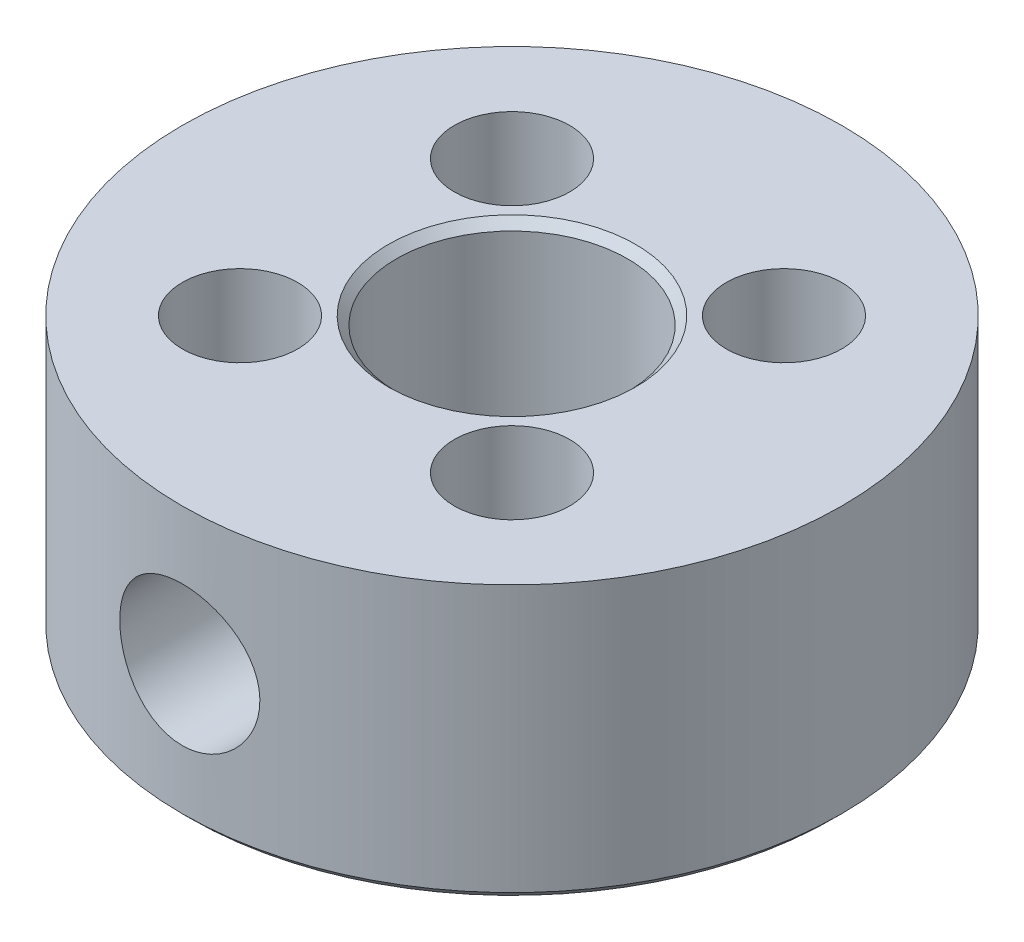
ISO-10303-21;
HEADER;
FILE_DESCRIPTION(('STEP AP214'),'2;1');
FILE_NAME('part.step','',(''),(''),'','','');
FILE_SCHEMA(('AUTOMOTIVE_DESIGN { 1 0 10303 214 1 1 1 1 }'));
ENDSEC;
DATA;
#1=APPLICATION_CONTEXT('core data for automotive mechanical design processes');
#2=APPLICATION_PROTOCOL_DEFINITION('international standard','automotive_design',2000,#1);
#3=PRODUCT_CONTEXT('',#1,'mechanical');
#4=PRODUCT('Part','Part','',(#3));
#5=PRODUCT_RELATED_PRODUCT_CATEGORY('part','',(#4));
#6=PRODUCT_DEFINITION_FORMATION('','',#4);
#7=PRODUCT_DEFINITION_CONTEXT('part definition',#1,'design');
#8=PRODUCT_DEFINITION('design','',#6,#7);
#9=PRODUCT_DEFINITION_SHAPE('','',#8);
#10=(LENGTH_UNIT() NAMED_UNIT(*) SI_UNIT(.MILLI.,.METRE.));
#11=(NAMED_UNIT(*) PLANE_ANGLE_UNIT() SI_UNIT($,.RADIAN.));
#12=(NAMED_UNIT(*) SI_UNIT($,.STERADIAN.) SOLID_ANGLE_UNIT());
#13=UNCERTAINTY_MEASURE_WITH_UNIT(LENGTH_MEASURE(1.E-05),#10,'distance_accuracy_value','');
#14=(GEOMETRIC_REPRESENTATION_CONTEXT(3) GLOBAL_UNCERTAINTY_ASSIGNED_CONTEXT((#13)) GLOBAL_UNIT_ASSIGNED_CONTEXT((#10,
#11,#12)) REPRESENTATION_CONTEXT('',''));
#15=CARTESIAN_POINT('',(0.,0.,0.));
#16=DIRECTION('',(0.,0.,1.));
#17=DIRECTION('',(1.,0.,0.));
#18=AXIS2_PLACEMENT_3D('',#15,#16,#17);
#19=CARTESIAN_POINT('',(-30.4497461438242,18.50200000001,-4.94974614382413));
#20=DIRECTION('',(0.,1.,0.));
#21=DIRECTION('',(0.,0.,1.));
#22=AXIS2_PLACEMENT_3D('',#19,#20,#21);
#23=CYLINDRICAL_SURFACE('',#22,1.25);
#24=CARTESIAN_POINT('',(-30.4497461438242,10.50000000001,-4.94974614382413));
#25=DIRECTION('',(0.,1.,0.));
#26=DIRECTION('',(0.,0.,1.));
#27=AXIS2_PLACEMENT_3D('',#24,#25,#26);
#28=CIRCLE('',#27,1.25);
#29=CARTESIAN_POINT('',(-30.4497461438242,10.50000000001,-3.69974614382413));
#30=VERTEX_POINT('',#29);
#31=EDGE_CURVE('E20',#30,#30,#28,.F.);
#32=ORIENTED_EDGE('',*,*,#31,.F.);
#33=EDGE_LOOP('',(#32));
#34=FACE_BOUND('',#33,.T.);
#35=CARTESIAN_POINT('',(-30.4497461438242,8.80000000000791,-4.94974614382413));
#36=DIRECTION('',(0.,-1.,0.));
#37=DIRECTION('',(0.,0.,-1.));
#38=AXIS2_PLACEMENT_3D('',#35,#36,#37);
#39=CIRCLE('',#38,1.24999999998268);
#40=CARTESIAN_POINT('',(-30.4497461438242,8.80000000000896,-3.69974614383279));
#41=VERTEX_POINT('',#40);
#42=EDGE_CURVE('E148',#41,#41,#39,.T.);
#43=ORIENTED_EDGE('',*,*,#42,.T.);
#44=EDGE_LOOP('',(#43));
#45=FACE_BOUND('',#44,.T.);
#46=ADVANCED_FACE('F17',(#34,#45),#23,.F.);
#47=CARTESIAN_POINT('',(-20.5502538561759,18.50200000001,-4.94974614382412));
#48=DIRECTION('',(0.,1.,0.));
#49=DIRECTION('',(0.,0.,1.));
#50=AXIS2_PLACEMENT_3D('',#47,#48,#49);
#51=CYLINDRICAL_SURFACE('',#50,1.25);
#52=CARTESIAN_POINT('',(-20.5502538561759,10.50000000001,-4.94974614382412));
#53=DIRECTION('',(0.,1.,0.));
#54=DIRECTION('',(0.,0.,1.));
#55=AXIS2_PLACEMENT_3D('',#52,#53,#54);
#56=CIRCLE('',#55,1.25);
#57=CARTESIAN_POINT('',(-20.5502538561759,10.50000000001,-3.69974614382412));
#58=VERTEX_POINT('',#57);
#59=EDGE_CURVE('E105',#58,#58,#56,.F.);
#60=ORIENTED_EDGE('',*,*,#59,.F.);
#61=EDGE_LOOP('',(#60));
#62=FACE_BOUND('',#61,.T.);
#63=CARTESIAN_POINT('',(-20.5502538561759,8.80000000000791,-4.94974614382412));
#64=DIRECTION('',(0.,-1.,0.));
#65=DIRECTION('',(0.,0.,-1.));
#66=AXIS2_PLACEMENT_3D('',#63,#64,#65);
#67=CIRCLE('',#66,1.24999999998269);
#68=CARTESIAN_POINT('',(-20.5502538561759,8.80000000000896,-3.69974614383278));
#69=VERTEX_POINT('',#68);
#70=EDGE_CURVE('E114',#69,#69,#67,.T.);
#71=ORIENTED_EDGE('',*,*,#70,.T.);
#72=EDGE_LOOP('',(#71));
#73=FACE_BOUND('',#72,.T.);
#74=ADVANCED_FACE('F289',(#62,#73),#51,.F.);
#75=CARTESIAN_POINT('',(-20.5502538561759,18.50200000001,4.94974614382412));
#76=DIRECTION('',(0.,1.,0.));
#77=DIRECTION('',(0.,0.,1.));
#78=AXIS2_PLACEMENT_3D('',#75,#76,#77);
#79=CYLINDRICAL_SURFACE('',#78,1.25);
#80=CARTESIAN_POINT('',(-20.5502538561759,10.50000000001,4.94974614382412));
#81=DIRECTION('',(0.,1.,0.));
#82=DIRECTION('',(0.,0.,1.));
#83=AXIS2_PLACEMENT_3D('',#80,#81,#82);
#84=CIRCLE('',#83,1.25);
#85=CARTESIAN_POINT('',(-20.5502538561759,10.50000000001,6.19974614382412));
#86=VERTEX_POINT('',#85);
#87=EDGE_CURVE('E222',#86,#86,#84,.F.);
#88=ORIENTED_EDGE('',*,*,#87,.F.);
#89=EDGE_LOOP('',(#88));
#90=FACE_BOUND('',#89,.T.);
#91=CARTESIAN_POINT('',(-20.5502538561759,8.80000000006476,4.94974614382412));
#92=DIRECTION('',(0.,-1.,0.));
#93=DIRECTION('',(0.,0.,-1.));
#94=AXIS2_PLACEMENT_3D('',#91,#92,#93);
#95=CIRCLE('',#94,1.2499999999582);
#96=CARTESIAN_POINT('',(-20.5502538561759,8.80000000003738,6.19974614380322));
#97=VERTEX_POINT('',#96);
#98=EDGE_CURVE('E33',#97,#97,#95,.T.);
#99=ORIENTED_EDGE('',*,*,#98,.T.);
#100=EDGE_LOOP('',(#99));
#101=FACE_BOUND('',#100,.T.);
#102=ADVANCED_FACE('F286',(#90,#101),#79,.F.);
#103=CARTESIAN_POINT('',(-30.4497461438242,18.50200000001,4.94974614382412));
#104=DIRECTION('',(0.,1.,0.));
#105=DIRECTION('',(0.,0.,1.));
#106=AXIS2_PLACEMENT_3D('',#103,#104,#105);
#107=CYLINDRICAL_SURFACE('',#106,1.25);
#108=CARTESIAN_POINT('',(-30.4497461438242,10.50000000001,4.94974614382412));
#109=DIRECTION('',(0.,1.,0.));
#110=DIRECTION('',(0.,0.,1.));
#111=AXIS2_PLACEMENT_3D('',#108,#109,#110);
#112=CIRCLE('',#111,1.25);
#113=CARTESIAN_POINT('',(-30.4497461438242,10.50000000001,6.19974614382412));
#114=VERTEX_POINT('',#113);
#115=EDGE_CURVE('E219',#114,#114,#112,.F.);
#116=ORIENTED_EDGE('',*,*,#115,.F.);
#117=EDGE_LOOP('',(#116));
#118=FACE_BOUND('',#117,.T.);
#119=CARTESIAN_POINT('',(-30.4497461438242,8.80000000006476,4.94974614382412));
#120=DIRECTION('',(0.,-1.,0.));
#121=DIRECTION('',(0.,0.,-1.));
#122=AXIS2_PLACEMENT_3D('',#119,#120,#121);
#123=CIRCLE('',#122,1.2499999999582);
#124=CARTESIAN_POINT('',(-30.4497461438242,8.80000000003738,6.19974614380322));
#125=VERTEX_POINT('',#124);
#126=EDGE_CURVE('E152',#125,#125,#123,.T.);
#127=ORIENTED_EDGE('',*,*,#126,.T.);
#128=EDGE_LOOP('',(#127));
#129=FACE_BOUND('',#128,.T.);
#130=ADVANCED_FACE('F282',(#118,#129),#107,.F.);
#131=CARTESIAN_POINT('',(-20.5502538561759,8.49999999996953,4.94974614382412));
#132=DIRECTION('',(0.,-1.,0.));
#133=DIRECTION('',(0.,0.,-1.));
#134=AXIS2_PLACEMENT_3D('',#131,#132,#133);
#135=CONICAL_SURFACE('',#134,1.54999999999658,0.785398163302709);
#136=ORIENTED_EDGE('',*,*,#98,.F.);
#137=EDGE_LOOP('',(#136));
#138=FACE_BOUND('',#137,.T.);
#139=CARTESIAN_POINT('',(-20.5502538561759,8.49999999996953,4.94974614382412));
#140=DIRECTION('',(0.,-1.,0.));
#141=DIRECTION('',(0.,0.,-1.));
#142=AXIS2_PLACEMENT_3D('',#139,#140,#141);
#143=CIRCLE('',#142,1.54999999999658);
#144=CARTESIAN_POINT('',(-20.5502538561759,8.49999999996953,6.4997461438207));
#145=VERTEX_POINT('',#144);
#146=EDGE_CURVE('E217',#145,#145,#143,.T.);
#147=ORIENTED_EDGE('',*,*,#146,.T.);
#148=EDGE_LOOP('',(#147));
#149=FACE_BOUND('',#148,.T.);
#150=ADVANCED_FACE('F278',(#138,#149),#135,.F.);
#151=CARTESIAN_POINT('',(-30.4497461438242,8.49999999996953,4.94974614382412));
#152=DIRECTION('',(0.,-1.,0.));
#153=DIRECTION('',(0.,0.,-1.));
#154=AXIS2_PLACEMENT_3D('',#151,#152,#153);
#155=CONICAL_SURFACE('',#154,1.54999999999658,0.785398163302709);
#156=ORIENTED_EDGE('',*,*,#126,.F.);
#157=EDGE_LOOP('',(#156));
#158=FACE_BOUND('',#157,.T.);
#159=CARTESIAN_POINT('',(-30.4497461438242,8.49999999996953,4.94974614382412));
#160=DIRECTION('',(0.,-1.,0.));
#161=DIRECTION('',(0.,0.,-1.));
#162=AXIS2_PLACEMENT_3D('',#159,#160,#161);
#163=CIRCLE('',#162,1.54999999999658);
#164=CARTESIAN_POINT('',(-30.4497461438242,8.49999999996953,6.4997461438207));
#165=VERTEX_POINT('',#164);
#166=EDGE_CURVE('E215',#165,#165,#163,.T.);
#167=ORIENTED_EDGE('',*,*,#166,.T.);
#168=EDGE_LOOP('',(#167));
#169=FACE_BOUND('',#168,.T.);
#170=ADVANCED_FACE('F274',(#158,#169),#155,.F.);
#171=CARTESIAN_POINT('',(-30.4497461438242,8.50000000002638,-4.94974614382413));
#172=DIRECTION('',(0.,-1.,0.));
#173=DIRECTION('',(0.,0.,-1.));
#174=AXIS2_PLACEMENT_3D('',#171,#172,#173);
#175=CONICAL_SURFACE('',#174,1.54999999996421,0.785398163397448);
#176=ORIENTED_EDGE('',*,*,#42,.F.);
#177=EDGE_LOOP('',(#176));
#178=FACE_BOUND('',#177,.T.);
#179=CARTESIAN_POINT('',(-30.4497461438242,8.50000000002638,-4.94974614382413));
#180=DIRECTION('',(0.,-1.,0.));
#181=DIRECTION('',(0.,0.,-1.));
#182=AXIS2_PLACEMENT_3D('',#179,#180,#181);
#183=CIRCLE('',#182,1.54999999996421);
#184=CARTESIAN_POINT('',(-30.4497461438242,8.50000000002638,-3.39974614385992));
#185=VERTEX_POINT('',#184);
#186=EDGE_CURVE('E213',#185,#185,#183,.T.);
#187=ORIENTED_EDGE('',*,*,#186,.T.);
#188=EDGE_LOOP('',(#187));
#189=FACE_BOUND('',#188,.T.);
#190=ADVANCED_FACE('F270',(#178,#189),#175,.F.);
#191=CARTESIAN_POINT('',(-20.5502538561759,8.50000000002638,-4.94974614382412));
#192=DIRECTION('',(0.,-1.,0.));
#193=DIRECTION('',(0.,0.,-1.));
#194=AXIS2_PLACEMENT_3D('',#191,#192,#193);
#195=CONICAL_SURFACE('',#194,1.54999999996422,0.785398163397448);
#196=ORIENTED_EDGE('',*,*,#70,.F.);
#197=EDGE_LOOP('',(#196));
#198=FACE_BOUND('',#197,.T.);
#199=CARTESIAN_POINT('',(-20.5502538561759,8.50000000002638,-4.94974614382412));
#200=DIRECTION('',(0.,-1.,0.));
#201=DIRECTION('',(0.,0.,-1.));
#202=AXIS2_PLACEMENT_3D('',#199,#200,#201);
#203=CIRCLE('',#202,1.54999999996422);
#204=CARTESIAN_POINT('',(-20.5502538561759,8.50000000002638,-3.3997461438599));
#205=VERTEX_POINT('',#204);
#206=EDGE_CURVE('E211',#205,#205,#203,.T.);
#207=ORIENTED_EDGE('',*,*,#206,.T.);
#208=EDGE_LOOP('',(#207));
#209=FACE_BOUND('',#208,.T.);
#210=ADVANCED_FACE('F230',(#198,#209),#195,.F.);
#211=CARTESIAN_POINT('',(-35.50000000002,10.50000000001,0.));
#212=DIRECTION('',(0.,1.,0.));
#213=DIRECTION('',(0.,0.,1.));
#214=AXIS2_PLACEMENT_3D('',#211,#212,#213);
#215=PLANE('',#214);
#216=ORIENTED_EDGE('',*,*,#31,.T.);
#217=EDGE_LOOP('',(#216));
#218=FACE_BOUND('',#217,.T.);
#219=CARTESIAN_POINT('',(-30.4497461438242,10.50000000001,-4.94974614382413));
#220=DIRECTION('',(0.,1.,0.));
#221=DIRECTION('',(0.,0.,1.));
#222=AXIS2_PLACEMENT_3D('',#219,#220,#221);
#223=CIRCLE('',#222,2.1);
#224=CARTESIAN_POINT('',(-30.4497461438242,10.50000000001,-2.84974614382413));
#225=VERTEX_POINT('',#224);
#226=EDGE_CURVE('E207',#225,#225,#223,.T.);
#227=ORIENTED_EDGE('',*,*,#226,.T.);
#228=EDGE_LOOP('',(#227));
#229=FACE_BOUND('',#228,.T.);
#230=ADVANCED_FACE('F226',(#218,#229),#215,.T.);
#231=CARTESIAN_POINT('',(-35.50000000002,10.50000000001,0.));
#232=DIRECTION('',(0.,1.,0.));
#233=DIRECTION('',(0.,0.,1.));
#234=AXIS2_PLACEMENT_3D('',#231,#232,#233);
#235=PLANE('',#234);
#236=ORIENTED_EDGE('',*,*,#59,.T.);
#237=EDGE_LOOP('',(#236));
#238=FACE_BOUND('',#237,.T.);
#239=CARTESIAN_POINT('',(-20.5502538561759,10.50000000001,-4.94974614382412));
#240=DIRECTION('',(0.,1.,0.));
#241=DIRECTION('',(0.,0.,1.));
#242=AXIS2_PLACEMENT_3D('',#239,#240,#241);
#243=CIRCLE('',#242,2.1);
#244=CARTESIAN_POINT('',(-20.5502538561759,10.50000000001,-2.84974614382412));
#245=VERTEX_POINT('',#244);
#246=EDGE_CURVE('E205',#245,#245,#243,.T.);
#247=ORIENTED_EDGE('',*,*,#246,.T.);
#248=EDGE_LOOP('',(#247));
#249=FACE_BOUND('',#248,.T.);
#250=ADVANCED_FACE('F229',(#238,#249),#235,.T.);
#251=CARTESIAN_POINT('',(-35.50000000002,10.50000000001,0.));
#252=DIRECTION('',(0.,1.,0.));
#253=DIRECTION('',(0.,0.,1.));
#254=AXIS2_PLACEMENT_3D('',#251,#252,#253);
#255=PLANE('',#254);
#256=ORIENTED_EDGE('',*,*,#87,.T.);
#257=EDGE_LOOP('',(#256));
#258=FACE_BOUND('',#257,.T.);
#259=CARTESIAN_POINT('',(-20.5502538561759,10.50000000001,4.94974614382412));
#260=DIRECTION('',(0.,1.,0.));
#261=DIRECTION('',(0.,0.,1.));
#262=AXIS2_PLACEMENT_3D('',#259,#260,#261);
#263=CIRCLE('',#262,2.1);
#264=CARTESIAN_POINT('',(-20.5502538561759,10.50000000001,7.04974614382412));
#265=VERTEX_POINT('',#264);
#266=EDGE_CURVE('E203',#265,#265,#263,.T.);
#267=ORIENTED_EDGE('',*,*,#266,.T.);
#268=EDGE_LOOP('',(#267));
#269=FACE_BOUND('',#268,.T.);
#270=ADVANCED_FACE('F261',(#258,#269),#255,.T.);
#271=CARTESIAN_POINT('',(-35.50000000002,10.50000000001,0.));
#272=DIRECTION('',(0.,1.,0.));
#273=DIRECTION('',(0.,0.,1.));
#274=AXIS2_PLACEMENT_3D('',#271,#272,#273);
#275=PLANE('',#274);
#276=ORIENTED_EDGE('',*,*,#115,.T.);
#277=EDGE_LOOP('',(#276));
#278=FACE_BOUND('',#277,.T.);
#279=CARTESIAN_POINT('',(-30.4497461438242,10.50000000001,4.94974614382412));
#280=DIRECTION('',(0.,1.,0.));
#281=DIRECTION('',(0.,0.,1.));
#282=AXIS2_PLACEMENT_3D('',#279,#280,#281);
#283=CIRCLE('',#282,2.1);
#284=CARTESIAN_POINT('',(-30.4497461438242,10.50000000001,7.04974614382412));
#285=VERTEX_POINT('',#284);
#286=EDGE_CURVE('E144',#285,#285,#283,.T.);
#287=ORIENTED_EDGE('',*,*,#286,.T.);
#288=EDGE_LOOP('',(#287));
#289=FACE_BOUND('',#288,.T.);
#290=ADVANCED_FACE('F257',(#278,#289),#275,.T.);
#291=CARTESIAN_POINT('',(-25.5,8.50000000002638,0.));
#292=DIRECTION('',(0.,-1.,0.));
#293=DIRECTION('',(0.,0.,-1.));
#294=AXIS2_PLACEMENT_3D('',#291,#292,#293);
#295=CONICAL_SURFACE('',#294,4.49999999995043,0.785398163302709);
#296=CARTESIAN_POINT('',(-25.5,8.80000000001,0.));
#297=DIRECTION('',(0.,1.,0.));
#298=DIRECTION('',(0.,0.,1.));
#299=AXIS2_PLACEMENT_3D('',#296,#297,#298);
#300=CIRCLE('',#299,4.2);
#301=CARTESIAN_POINT('',(-25.5,8.80000000000896,4.20000000001287));
#302=VERTEX_POINT('',#301);
#303=EDGE_CURVE('E137',#302,#302,#300,.T.);
#304=ORIENTED_EDGE('',*,*,#303,.T.);
#305=EDGE_LOOP('',(#304));
#306=FACE_BOUND('',#305,.T.);
#307=CARTESIAN_POINT('',(-25.5,8.50000000002638,0.));
#308=DIRECTION('',(0.,-1.,0.));
#309=DIRECTION('',(0.,0.,-1.));
#310=AXIS2_PLACEMENT_3D('',#307,#308,#309);
#311=CIRCLE('',#310,4.49999999995043);
#312=CARTESIAN_POINT('',(-25.5,8.50000000002638,4.49999999995043));
#313=VERTEX_POINT('',#312);
#314=EDGE_CURVE('E209',#313,#313,#311,.T.);
#315=ORIENTED_EDGE('',*,*,#314,.T.);
#316=EDGE_LOOP('',(#315));
#317=FACE_BOUND('',#316,.T.);
#318=ADVANCED_FACE('F253',(#306,#317),#295,.F.);
#319=CARTESIAN_POINT('',(-35.50000000002,8.50000000001,0.));
#320=DIRECTION('',(0.,1.,0.));
#321=DIRECTION('',(0.,0.,1.));
#322=AXIS2_PLACEMENT_3D('',#319,#320,#321);
#323=PLANE('',#322);
#324=CARTESIAN_POINT('',(-25.5,8.50000000001077,0.));
#325=DIRECTION('',(0.,1.,0.));
#326=DIRECTION('',(0.,0.,1.));
#327=AXIS2_PLACEMENT_3D('',#324,#325,#326);
#328=CIRCLE('',#327,11.6999999999992);
#329=CARTESIAN_POINT('',(-25.5,8.50000000001077,11.6999999999992));
#330=VERTEX_POINT('',#329);
#331=EDGE_CURVE('E139',#330,#330,#328,.T.);
#332=ORIENTED_EDGE('',*,*,#331,.F.);
#333=EDGE_LOOP('',(#332));
#334=FACE_BOUND('',#333,.T.);
#335=ORIENTED_EDGE('',*,*,#314,.F.);
#336=EDGE_LOOP('',(#335));
#337=FACE_BOUND('',#336,.T.);
#338=ORIENTED_EDGE('',*,*,#206,.F.);
#339=EDGE_LOOP('',(#338));
#340=FACE_BOUND('',#339,.T.);
#341=ORIENTED_EDGE('',*,*,#186,.F.);
#342=EDGE_LOOP('',(#341));
#343=FACE_BOUND('',#342,.T.);
#344=ORIENTED_EDGE('',*,*,#166,.F.);
#345=EDGE_LOOP('',(#344));
#346=FACE_BOUND('',#345,.T.);
#347=ORIENTED_EDGE('',*,*,#146,.F.);
#348=EDGE_LOOP('',(#347));
#349=FACE_BOUND('',#348,.T.);
#350=ADVANCED_FACE('F247',(#334,#337,#340,#343,#346,#349),#323,.F.);
#351=CARTESIAN_POINT('',(-25.5,18.4999999999036,0.));
#352=DIRECTION('',(0.,1.,0.));
#353=DIRECTION('',(0.,0.,1.));
#354=AXIS2_PLACEMENT_3D('',#351,#352,#353);
#355=CONICAL_SURFACE('',#354,4.49999999989359,0.785398163397448);
#356=CARTESIAN_POINT('',(-25.5,18.4999999999604,0.));
#357=DIRECTION('',(0.,1.,0.));
#358=DIRECTION('',(0.,0.,1.));
#359=AXIS2_PLACEMENT_3D('',#356,#357,#358);
#360=CIRCLE('',#359,4.49999999995043);
#361=CARTESIAN_POINT('',(-25.5,18.4999999999604,4.49999999995043));
#362=VERTEX_POINT('',#361);
#363=EDGE_CURVE('E194',#362,#362,#360,.F.);
#364=ORIENTED_EDGE('',*,*,#363,.F.);
#365=EDGE_LOOP('',(#364));
#366=FACE_BOUND('',#365,.T.);
#367=CARTESIAN_POINT('',(-25.5,18.20000000001,0.));
#368=DIRECTION('',(0.,1.,0.));
#369=DIRECTION('',(0.,0.,1.));
#370=AXIS2_PLACEMENT_3D('',#367,#368,#369);
#371=CIRCLE('',#370,4.2);
#372=CARTESIAN_POINT('',(-25.5,18.2000000000229,4.19999999998445));
#373=VERTEX_POINT('',#372);
#374=EDGE_CURVE('E140',#373,#373,#371,.F.);
#375=ORIENTED_EDGE('',*,*,#374,.T.);
#376=EDGE_LOOP('',(#375));
#377=FACE_BOUND('',#376,.T.);
#378=ADVANCED_FACE('F237',(#366,#377),#355,.F.);
#379=CARTESIAN_POINT('',(-30.4497461438242,18.50200000001,-4.94974614382413));
#380=DIRECTION('',(0.,1.,0.));
#381=DIRECTION('',(0.,0.,1.));
#382=AXIS2_PLACEMENT_3D('',#379,#380,#381);
#383=CYLINDRICAL_SURFACE('',#382,2.1);
#384=CARTESIAN_POINT('',(-30.4497461438242,18.50000000001,-4.94974614382413));
#385=DIRECTION('',(0.,1.,0.));
#386=DIRECTION('',(0.,0.,1.));
#387=AXIS2_PLACEMENT_3D('',#384,#385,#386);
#388=CIRCLE('',#387,2.1);
#389=CARTESIAN_POINT('',(-30.4497461438242,18.50000000001,-2.84974614382413));
#390=VERTEX_POINT('',#389);
#391=EDGE_CURVE('E192',#390,#390,#388,.F.);
#392=ORIENTED_EDGE('',*,*,#391,.F.);
#393=EDGE_LOOP('',(#392));
#394=FACE_BOUND('',#393,.T.);
#395=ORIENTED_EDGE('',*,*,#226,.F.);
#396=EDGE_LOOP('',(#395));
#397=FACE_BOUND('',#396,.T.);
#398=ADVANCED_FACE('F234',(#394,#397),#383,.F.);
#399=CARTESIAN_POINT('',(-20.5502538561759,18.50200000001,-4.94974614382412));
#400=DIRECTION('',(0.,1.,0.));
#401=DIRECTION('',(0.,0.,1.));
#402=AXIS2_PLACEMENT_3D('',#399,#400,#401);
#403=CYLINDRICAL_SURFACE('',#402,2.1);
#404=CARTESIAN_POINT('',(-20.5502538561759,18.50000000001,-4.94974614382412));
#405=DIRECTION('',(0.,1.,0.));
#406=DIRECTION('',(0.,0.,1.));
#407=AXIS2_PLACEMENT_3D('',#404,#405,#406);
#408=CIRCLE('',#407,2.1);
#409=CARTESIAN_POINT('',(-20.5502538561759,18.50000000001,-2.84974614382412));
#410=VERTEX_POINT('',#409);
#411=EDGE_CURVE('E189',#410,#410,#408,.F.);
#412=ORIENTED_EDGE('',*,*,#411,.F.);
#413=EDGE_LOOP('',(#412));
#414=FACE_BOUND('',#413,.T.);
#415=ORIENTED_EDGE('',*,*,#246,.F.);
#416=EDGE_LOOP('',(#415));
#417=FACE_BOUND('',#416,.T.);
#418=ADVANCED_FACE('F236',(#414,#417),#403,.F.);
#419=CARTESIAN_POINT('',(-20.5502538561759,18.50200000001,4.94974614382412));
#420=DIRECTION('',(0.,1.,0.));
#421=DIRECTION('',(0.,0.,1.));
#422=AXIS2_PLACEMENT_3D('',#419,#420,#421);
#423=CYLINDRICAL_SURFACE('',#422,2.1);
#424=CARTESIAN_POINT('',(-20.5502538561759,18.50000000001,4.94974614382412));
#425=DIRECTION('',(0.,1.,0.));
#426=DIRECTION('',(0.,0.,1.));
#427=AXIS2_PLACEMENT_3D('',#424,#425,#426);
#428=CIRCLE('',#427,2.1);
#429=CARTESIAN_POINT('',(-20.5502538561759,18.50000000001,7.04974614382412));
#430=VERTEX_POINT('',#429);
#431=EDGE_CURVE('E186',#430,#430,#428,.F.);
#432=ORIENTED_EDGE('',*,*,#431,.F.);
#433=EDGE_LOOP('',(#432));
#434=FACE_BOUND('',#433,.T.);
#435=ORIENTED_EDGE('',*,*,#266,.F.);
#436=EDGE_LOOP('',(#435));
#437=FACE_BOUND('',#436,.T.);
#438=ADVANCED_FACE('F244',(#434,#437),#423,.F.);
#439=CARTESIAN_POINT('',(-30.4497461438242,18.50200000001,4.94974614382412));
#440=DIRECTION('',(0.,1.,0.));
#441=DIRECTION('',(0.,0.,1.));
#442=AXIS2_PLACEMENT_3D('',#439,#440,#441);
#443=CYLINDRICAL_SURFACE('',#442,2.1);
#444=CARTESIAN_POINT('',(-30.4497461438242,18.50000000001,4.94974614382412));
#445=DIRECTION('',(0.,1.,0.));
#446=DIRECTION('',(0.,0.,1.));
#447=AXIS2_PLACEMENT_3D('',#444,#445,#446);
#448=CIRCLE('',#447,2.1);
#449=CARTESIAN_POINT('',(-30.4497461438242,18.50000000001,7.04974614382412));
#450=VERTEX_POINT('',#449);
#451=EDGE_CURVE('E132',#450,#450,#448,.F.);
#452=ORIENTED_EDGE('',*,*,#451,.F.);
#453=EDGE_LOOP('',(#452));
#454=FACE_BOUND('',#453,.T.);
#455=ORIENTED_EDGE('',*,*,#286,.F.);
#456=EDGE_LOOP('',(#455));
#457=FACE_BOUND('',#456,.T.);
#458=ADVANCED_FACE('F414',(#454,#457),#443,.F.);
#459=CARTESIAN_POINT('',(-25.5,18.50200000001,0.));
#460=DIRECTION('',(0.,1.,0.));
#461=DIRECTION('',(0.,0.,1.));
#462=AXIS2_PLACEMENT_3D('',#459,#460,#461);
#463=CYLINDRICAL_SURFACE('',#462,4.2);
#464=CARTESIAN_POINT('',(-28.0466918310846,13.3701511743004,3.33981447351304));
#465=CARTESIAN_POINT('',(-28.0399996927325,13.2388615684585,3.34491603063782));
#466=CARTESIAN_POINT('',(-28.023102492779,13.1084142548455,3.35783801589314));
#467=CARTESIAN_POINT('',(-27.9701303416004,12.8534980770102,3.39698439092769));
#468=CARTESIAN_POINT('',(-27.9340270450937,12.7290383463658,3.42322843942132));
#469=CARTESIAN_POINT('',(-27.8449347452476,12.4900840818974,3.48484833870774));
#470=CARTESIAN_POINT('',(-27.7920841493058,12.3755173307071,3.52014890239554));
#471=CARTESIAN_POINT('',(-27.6711214840442,12.1567315719691,3.59601547695757));
#472=CARTESIAN_POINT('',(-27.6030070928127,12.0525141422333,3.63658228853226));
#473=CARTESIAN_POINT('',(-27.4425014345844,11.8419831940034,3.72507480071735));
#474=CARTESIAN_POINT('',(-27.3480649178397,11.7373280620777,3.77324875811566));
#475=CARTESIAN_POINT('',(-27.1425461857975,11.5443881769187,3.86714613784206));
#476=CARTESIAN_POINT('',(-27.031453306492,11.456113992977,3.91286796457863));
#477=CARTESIAN_POINT('',(-26.786672101706,11.2932096934457,4.00030022973895));
#478=CARTESIAN_POINT('',(-26.6519938706441,11.2198109033266,4.04156803311493));
#479=CARTESIAN_POINT('',(-26.3689270226317,11.0976813339225,4.11170609338944));
#480=CARTESIAN_POINT('',(-26.2205565186165,11.0489185026417,4.14059245139574));
#481=CARTESIAN_POINT('',(-25.934072656692,10.9834663732055,4.17969510752418));
#482=CARTESIAN_POINT('',(-25.7969484958791,10.9635650830715,4.19177349690257));
#483=CARTESIAN_POINT('',(-25.5207983243213,10.9463428741486,4.20221465044528));
#484=CARTESIAN_POINT('',(-25.3817735878406,10.9490075021478,4.20058619369144));
#485=CARTESIAN_POINT('',(-25.1214938622602,10.9752203028051,4.18472587081963));
#486=CARTESIAN_POINT('',(-24.9999183155986,10.9965231338,4.17184931761434));
#487=CARTESIAN_POINT('',(-24.7624332205967,11.055929364554,4.13647339406768));
#488=CARTESIAN_POINT('',(-24.646524431958,11.0940350101223,4.11397273741222));
#489=CARTESIAN_POINT('',(-24.4187618021801,11.1871830505372,4.06018784499785));
#490=CARTESIAN_POINT('',(-24.3072116148504,11.2427942584789,4.02861228490887));
#491=CARTESIAN_POINT('',(-24.0947152493664,11.3685822676862,3.95950488985953));
#492=CARTESIAN_POINT('',(-23.9937728852432,11.4387642810644,3.92197092465622));
#493=CARTESIAN_POINT('',(-23.7910623118112,11.602324408979,3.83837056587799));
#494=CARTESIAN_POINT('',(-23.6909737377163,11.6975468324155,3.79183351606557));
#495=CARTESIAN_POINT('',(-23.5073047618537,11.902907053756,3.69862132286565));
#496=CARTESIAN_POINT('',(-23.4237493027998,12.0130669715259,3.65194607704245));
#497=CARTESIAN_POINT('',(-23.2676810987158,12.2581253760449,3.55889957098511));
#498=CARTESIAN_POINT('',(-23.1969770094894,12.3943806079902,3.51298031173102));
#499=CARTESIAN_POINT('',(-23.1095990181085,12.608690241505,3.45358239535067));
#500=CARTESIAN_POINT('',(-23.0835956812504,12.6817362041902,3.43537103810313));
#501=CARTESIAN_POINT('',(-23.0381736814787,12.8306933434966,3.40296690753615));
#502=CARTESIAN_POINT('',(-23.0187518970867,12.9066031428278,3.38877222972678));
#503=CARTESIAN_POINT('',(-22.9796095752904,13.0959560555893,3.35983615782329));
#504=CARTESIAN_POINT('',(-22.9638189101986,13.2106796134023,3.34781670899586));
#505=CARTESIAN_POINT('',(-22.9480383833465,13.4417519675926,3.33580534703037));
#506=CARTESIAN_POINT('',(-22.9480363897793,13.558099447423,3.33580419918806));
#507=CARTESIAN_POINT('',(-22.9637857461499,13.7889539015179,3.34779109397998));
#508=CARTESIAN_POINT('',(-22.979521825557,13.9034625505548,3.35976751487126));
#509=CARTESIAN_POINT('',(-23.0258419165542,14.1278515121857,3.39401724771358));
#510=CARTESIAN_POINT('',(-23.0564386518415,14.2377277707515,3.41629938263758));
#511=CARTESIAN_POINT('',(-23.1330682612357,14.4561404573398,3.46985775186049));
#512=CARTESIAN_POINT('',(-23.179801509649,14.5643301405187,3.50153075059326));
#513=CARTESIAN_POINT('',(-23.2867984916489,14.7719670302082,3.57012283745897));
#514=CARTESIAN_POINT('',(-23.3470686611479,14.8714100468578,3.60704441787093));
#515=CARTESIAN_POINT('',(-23.4933234502079,15.079554850888,3.69075598762224));
#516=CARTESIAN_POINT('',(-23.5820393368424,15.1861458677781,3.73804523028403));
#517=CARTESIAN_POINT('',(-23.7759343037413,15.3839583349195,3.83134338591176));
#518=CARTESIAN_POINT('',(-23.8811277705013,15.4751662083301,3.87735113827688));
#519=CARTESIAN_POINT('',(-24.1163363363779,15.6473235663662,3.96770364213218));
#520=CARTESIAN_POINT('',(-24.2477141346232,15.7266925139474,4.01155632905706));
#521=CARTESIAN_POINT('',(-24.5252818793277,15.8613847970785,4.08785435492861));
#522=CARTESIAN_POINT('',(-24.6714542852996,15.9167362053673,4.12031300319466));
#523=CARTESIAN_POINT('',(-24.9573469111796,15.995504436287,4.16703232431877));
#524=CARTESIAN_POINT('',(-25.0960193251762,16.0217557177197,4.18289721518859));
#525=CARTESIAN_POINT('',(-25.3766466706175,16.0509081703482,4.20053400025264));
#526=CARTESIAN_POINT('',(-25.5185988225987,16.05382843483,4.20231741821642));
#527=CARTESIAN_POINT('',(-25.783614641641,16.0372362004145,4.19226023393419));
#528=CARTESIAN_POINT('',(-25.90691666158,16.0203506673599,4.18201491911878));
#529=CARTESIAN_POINT('',(-26.1485463204956,15.9692382830577,4.15141162067632));
#530=CARTESIAN_POINT('',(-26.2668734472655,15.9350096509049,4.13105259851054));
#531=CARTESIAN_POINT('',(-26.4979482129417,15.8499052074223,4.08146284359483));
#532=CARTESIAN_POINT('',(-26.6105505859179,15.7987307522599,4.05207369284694));
#533=CARTESIAN_POINT('',(-26.8257738217153,15.6817071047785,3.98685181949657));
#534=CARTESIAN_POINT('',(-26.9283917469807,15.6158536123354,3.95101720933574));
#535=CARTESIAN_POINT('',(-27.1346397336788,15.461900034566,3.87062012756685));
#536=CARTESIAN_POINT('',(-27.2367471136759,15.3720376447401,3.8255271365475));
#537=CARTESIAN_POINT('',(-27.4253375874195,15.1774884806053,3.73417759996632));
#538=CARTESIAN_POINT('',(-27.5117982976331,15.0727808449647,3.68791949365795));
#539=CARTESIAN_POINT('',(-27.6762227808311,14.8376670368555,3.59360331667079));
#540=CARTESIAN_POINT('',(-27.7521880539402,14.7056993250083,3.54591235770874));
#541=CARTESIAN_POINT('',(-27.8802338429126,14.4275300905856,3.46127446557713));
#542=CARTESIAN_POINT('',(-27.9323601721339,14.2813565300438,3.42430697464602));
#543=CARTESIAN_POINT('',(-28.002172976589,14.0075463939624,3.37352038649179));
#544=CARTESIAN_POINT('',(-28.0245288872612,13.8816840154316,3.35663288034242));
#545=CARTESIAN_POINT('',(-28.0500396049437,13.6269953661973,3.33730128096145));
#546=CARTESIAN_POINT('',(-28.0532173943136,13.4981728288401,3.33483990009075));
#547=CARTESIAN_POINT('',(-28.0466918310846,13.3701511743004,3.33981447351304));
#548=B_SPLINE_CURVE_WITH_KNOTS('',3,(#464,#465,#466,#467,#468,#469,#470,#471,#472,#473,#474,
#475,#476,#477,#478,#479,#480,#481,#482,#483,#484,#485,#486,#487,#488,#489,#490,#491,#492,#493,
#494,#495,#496,#497,#498,#499,#500,#501,#502,#503,#504,#505,#506,#507,#508,#509,#510,#511,#512,
#513,#514,#515,#516,#517,#518,#519,#520,#521,#522,#523,#524,#525,#526,#527,#528,#529,#530,#531,
#532,#533,#534,#535,#536,#537,#538,#539,#540,#541,#542,#543,#544,#545,#546,#547),.UNSPECIFIED.,
.T.,.F.,(4,2,2,2,2,2,2,2,2,2,2,2,2,2,2,2,2,2,2,2,2,2,2,2,2,2,2,2,2,2,2,2,2,2,2,2,2,2,2,2,2,4),
(0.,0.394103304784507,0.788789866416294,1.18029608586018,1.57186190127716,2.01691651130305,
2.46225728789939,2.93603796169292,3.40920063737703,3.82405394426071,4.23864156246401,
4.60924914091157,4.97990626857612,5.36412873632146,5.74848888155151,6.18402653807501,
6.62021634166916,7.097933404556,7.33651651721747,7.57498631652583,7.92257585062681,
8.2698983014858,8.61688407468264,8.96416746230264,9.32895712421481,9.69392058803843,
10.1316947227464,10.5698532285456,11.0460930240056,11.5217746604055,11.9453379667056,
12.3685546081087,12.7414314258293,13.1143465407911,13.4942184497635,13.8742017862164,
14.3023837890503,14.7311735724045,15.2074048911817,15.6827171089567,16.0674718909409,
16.4517655051574),.UNSPECIFIED.);
#549=CARTESIAN_POINT('',(-28.0466918285131,13.3701511238667,3.33981447547386));
#550=VERTEX_POINT('',#549);
#551=EDGE_CURVE('E128',#550,#550,#548,.T.);
#552=ORIENTED_EDGE('',*,*,#551,.T.);
#553=EDGE_LOOP('',(#552));
#554=FACE_BOUND('',#553,.T.);
#555=ORIENTED_EDGE('',*,*,#303,.F.);
#556=EDGE_LOOP('',(#555));
#557=FACE_BOUND('',#556,.T.);
#558=ORIENTED_EDGE('',*,*,#374,.F.);
#559=EDGE_LOOP('',(#558));
#560=FACE_BOUND('',#559,.T.);
#561=ADVANCED_FACE('F423',(#554,#557,#560),#463,.F.);
#562=CARTESIAN_POINT('',(-25.5,8.80000000001,0.));
#563=DIRECTION('',(0.,1.,0.));
#564=DIRECTION('',(0.,0.,1.));
#565=AXIS2_PLACEMENT_3D('',#562,#563,#564);
#566=CONICAL_SURFACE('',#565,12.,0.785398163400007);
#567=CARTESIAN_POINT('',(-25.5,8.80000000001,0.));
#568=DIRECTION('',(0.,1.,0.));
#569=DIRECTION('',(0.,0.,1.));
#570=AXIS2_PLACEMENT_3D('',#567,#568,#569);
#571=CIRCLE('',#570,12.);
#572=CARTESIAN_POINT('',(-25.5,8.80000000001,12.));
#573=VERTEX_POINT('',#572);
#574=EDGE_CURVE('E124',#573,#573,#571,.T.);
#575=ORIENTED_EDGE('',*,*,#574,.F.);
#576=EDGE_LOOP('',(#575));
#577=FACE_BOUND('',#576,.T.);
#578=ORIENTED_EDGE('',*,*,#331,.T.);
#579=EDGE_LOOP('',(#578));
#580=FACE_BOUND('',#579,.T.);
#581=ADVANCED_FACE('F125',(#577,#580),#566,.T.);
#582=CARTESIAN_POINT('',(-35.50000000002,18.50000000001,0.));
#583=DIRECTION('',(0.,1.,0.));
#584=DIRECTION('',(0.,0.,1.));
#585=AXIS2_PLACEMENT_3D('',#582,#583,#584);
#586=PLANE('',#585);
#587=CARTESIAN_POINT('',(-25.5,18.50000000001,0.));
#588=DIRECTION('',(0.,1.,0.));
#589=DIRECTION('',(0.,0.,1.));
#590=AXIS2_PLACEMENT_3D('',#587,#588,#589);
#591=CIRCLE('',#590,12.);
#592=CARTESIAN_POINT('',(-25.5,18.50000000001,12.));
#593=VERTEX_POINT('',#592);
#594=EDGE_CURVE('E26',#593,#593,#591,.F.);
#595=ORIENTED_EDGE('',*,*,#594,.F.);
#596=EDGE_LOOP('',(#595));
#597=FACE_BOUND('',#596,.T.);
#598=ORIENTED_EDGE('',*,*,#451,.T.);
#599=EDGE_LOOP('',(#598));
#600=FACE_BOUND('',#599,.T.);
#601=ORIENTED_EDGE('',*,*,#431,.T.);
#602=EDGE_LOOP('',(#601));
#603=FACE_BOUND('',#602,.T.);
#604=ORIENTED_EDGE('',*,*,#411,.T.);
#605=EDGE_LOOP('',(#604));
#606=FACE_BOUND('',#605,.T.);
#607=ORIENTED_EDGE('',*,*,#391,.T.);
#608=EDGE_LOOP('',(#607));
#609=FACE_BOUND('',#608,.T.);
#610=ORIENTED_EDGE('',*,*,#363,.T.);
#611=EDGE_LOOP('',(#610));
#612=FACE_BOUND('',#611,.T.);
#613=ADVANCED_FACE('F176',(#597,#600,#603,#606,#609,#612),#586,.T.);
#614=CARTESIAN_POINT('',(-25.50000000001,13.50000000001,25.));
#615=DIRECTION('',(0.,0.,1.));
#616=DIRECTION('',(1.,0.,0.));
#617=AXIS2_PLACEMENT_3D('',#614,#615,#616);
#618=CYLINDRICAL_SURFACE('',#617,2.55);
#619=CARTESIAN_POINT('',(-28.0468739381714,13.6262265547215,11.7266121767143));
#620=CARTESIAN_POINT('',(-28.0398470354152,13.7679055083971,11.7281400474601));
#621=CARTESIAN_POINT('',(-28.0209661095991,13.9090320961848,11.7322513854545));
#622=CARTESIAN_POINT('',(-27.9600770005743,14.1860521823974,11.7451677549748));
#623=CARTESIAN_POINT('',(-27.9180503322365,14.3219414051154,11.7539765378921));
#624=CARTESIAN_POINT('',(-27.8122343641115,14.5844705974769,11.7752479867642));
#625=CARTESIAN_POINT('',(-27.7484696226266,14.7111208096094,11.7877065272287));
#626=CARTESIAN_POINT('',(-27.6010223911106,14.9519449466601,11.8148763658734));
#627=CARTESIAN_POINT('',(-27.517340829371,15.0661194526895,11.8295875590495));
#628=CARTESIAN_POINT('',(-27.3309635965603,15.2806039100727,11.8598732684453));
#629=CARTESIAN_POINT('',(-27.2280069164945,15.3806858127993,11.8754572857464));
#630=CARTESIAN_POINT('',(-27.0066811274391,15.5622563956025,11.9055602127577));
#631=CARTESIAN_POINT('',(-26.8883112245448,15.643744117334,11.9200790675432));
#632=CARTESIAN_POINT('',(-26.6385871734859,15.7862429239023,11.946524896712));
#633=CARTESIAN_POINT('',(-26.5071589558221,15.8471274258052,11.9584356953322));
#634=CARTESIAN_POINT('',(-26.2356293413244,15.9458558782733,11.978203353649));
#635=CARTESIAN_POINT('',(-26.0955290134444,15.9837026623404,11.9860607118764));
#636=CARTESIAN_POINT('',(-25.8132048712804,16.0346844166666,11.9967291351498));
#637=CARTESIAN_POINT('',(-25.6710588912472,16.0482327714136,11.9996245776383));
#638=CARTESIAN_POINT('',(-25.3864926824848,16.0514424944418,12.0003064184577));
#639=CARTESIAN_POINT('',(-25.2440724790829,16.0411059720595,11.9980932679419));
#640=CARTESIAN_POINT('',(-24.9650010120775,15.9971912385527,11.9888706587242));
#641=CARTESIAN_POINT('',(-24.8282979565904,15.9639270594566,11.9819260201817));
#642=CARTESIAN_POINT('',(-24.562438272809,15.8755223014982,11.9640604936645));
#643=CARTESIAN_POINT('',(-24.4332821297929,15.8203803176312,11.9531393503201));
#644=CARTESIAN_POINT('',(-24.1846588105774,15.6891425866982,11.9283555085999));
#645=CARTESIAN_POINT('',(-24.0653076620826,15.6128328181876,11.9144631161237));
#646=CARTESIAN_POINT('',(-23.8409487367666,15.4416400861113,11.8853005495213));
#647=CARTESIAN_POINT('',(-23.7359427980611,15.3467547461576,11.8700301992468));
#648=CARTESIAN_POINT('',(-23.5411945049673,15.1389733422,11.8394678443482));
#649=CARTESIAN_POINT('',(-23.4517775904277,15.0257711829304,11.8241808692706));
#650=CARTESIAN_POINT('',(-23.2931818251687,14.7857461342959,11.795612305894));
#651=CARTESIAN_POINT('',(-23.2240028037973,14.6589233597964,11.7823307006856));
#652=CARTESIAN_POINT('',(-23.1080202088631,14.3953382841417,11.7593342955033));
#653=CARTESIAN_POINT('',(-23.0611835824946,14.258591012536,11.7496142316414));
#654=CARTESIAN_POINT('',(-22.9912343096205,13.9789191037026,11.7348791915069));
#655=CARTESIAN_POINT('',(-22.9681180107948,13.8359954210159,11.7298634908936));
#656=CARTESIAN_POINT('',(-22.9465964049076,13.5511467202818,11.7251971695404));
#657=CARTESIAN_POINT('',(-22.9476977549884,13.4092605768809,11.7254394363014));
#658=CARTESIAN_POINT('',(-22.9733627336244,13.1277346288188,11.730996215876));
#659=CARTESIAN_POINT('',(-22.997925485792,12.9880947404482,11.7363105392257));
#660=CARTESIAN_POINT('',(-23.0694592340278,12.716024296708,11.7513310368696));
#661=CARTESIAN_POINT('',(-23.11626725676,12.5835489907422,11.7610052435441));
#662=CARTESIAN_POINT('',(-23.2308221071349,12.3282885124107,11.7836421870026));
#663=CARTESIAN_POINT('',(-23.2985711598238,12.2055043715011,11.7966052732137));
#664=CARTESIAN_POINT('',(-23.4544550972233,11.9708065827435,11.8246397227881));
#665=CARTESIAN_POINT('',(-23.5429216454641,11.8591171270738,11.8397436120194));
#666=CARTESIAN_POINT('',(-23.7371688369457,11.6520043738392,11.87021786376));
#667=CARTESIAN_POINT('',(-23.8429512574851,11.5565827480566,11.885588253478));
#668=CARTESIAN_POINT('',(-24.0707354213222,11.3832849315817,11.915140144469));
#669=CARTESIAN_POINT('',(-24.1929558563329,11.3056921463484,11.9293004547832));
#670=CARTESIAN_POINT('',(-24.4490032781054,11.1721796736091,11.954577858533));
#671=CARTESIAN_POINT('',(-24.5828294080979,11.1162583879084,11.9656951763605));
#672=CARTESIAN_POINT('',(-24.8569143574185,11.0282702037355,11.9835345114928));
#673=CARTESIAN_POINT('',(-24.997095700071,10.9959709349042,11.9902992633632));
#674=CARTESIAN_POINT('',(-25.2810347392117,10.955375349644,11.9988421206486));
#675=CARTESIAN_POINT('',(-25.4247919755518,10.9470759608476,12.0006208643513));
#676=CARTESIAN_POINT('',(-25.7089164605354,10.9546763809962,11.999006819316));
#677=CARTESIAN_POINT('',(-25.8492966089235,10.9701239122754,11.9957106835706));
#678=CARTESIAN_POINT('',(-26.1254097394207,11.0238849236911,11.9844883884959));
#679=CARTESIAN_POINT('',(-26.2611426852285,11.0621985824017,11.9765621930079));
#680=CARTESIAN_POINT('',(-26.5243495099643,11.1605618746914,11.9569293549735));
#681=CARTESIAN_POINT('',(-26.6518143999756,11.2206347125639,11.9452186780457));
#682=CARTESIAN_POINT('',(-26.8949518456099,11.3607702967967,11.919273390725));
#683=CARTESIAN_POINT('',(-27.010623205821,11.4408350667417,11.9050385248758));
#684=CARTESIAN_POINT('',(-27.2292711481807,11.6204986856645,11.8752703392735));
#685=CARTESIAN_POINT('',(-27.3319607702457,11.7204436300363,11.8597173113547));
#686=CARTESIAN_POINT('',(-27.5192487506356,11.9361770575369,11.8292713803866));
#687=CARTESIAN_POINT('',(-27.6038431741689,12.0519689776245,11.8143786214695));
#688=CARTESIAN_POINT('',(-27.7532311620937,12.2973886607035,11.7868057564499));
#689=CARTESIAN_POINT('',(-27.817839412295,12.4271317072646,11.7741468001226));
#690=CARTESIAN_POINT('',(-27.9242015129556,12.6958898915797,11.7527112095127));
#691=CARTESIAN_POINT('',(-27.9659759108099,12.834896566497,11.7439310861716));
#692=CARTESIAN_POINT('',(-28.018037748512,13.083033737934,11.7328591594785));
#693=CARTESIAN_POINT('',(-28.03355781363,13.1910487925373,11.7294996225123));
#694=CARTESIAN_POINT('',(-28.0506746674561,13.4082267653196,11.725789335292));
#695=CARTESIAN_POINT('',(-28.0522719622584,13.5173896416306,11.7254384756721));
#696=CARTESIAN_POINT('',(-28.0468739381714,13.6262265547215,11.7266121767143));
#697=B_SPLINE_CURVE_WITH_KNOTS('',3,(#619,#620,#621,#622,#623,#624,#625,#626,#627,#628,#629,
#630,#631,#632,#633,#634,#635,#636,#637,#638,#639,#640,#641,#642,#643,#644,#645,#646,#647,#648,
#649,#650,#651,#652,#653,#654,#655,#656,#657,#658,#659,#660,#661,#662,#663,#664,#665,#666,#667,
#668,#669,#670,#671,#672,#673,#674,#675,#676,#677,#678,#679,#680,#681,#682,#683,#684,#685,#686,
#687,#688,#689,#690,#691,#692,#693,#694,#695,#696),.UNSPECIFIED.,.T.,.F.,(4,2,2,2,2,2,2,2,2,2,2,
2,2,2,2,2,2,2,2,2,2,2,2,2,2,2,2,2,2,2,2,2,2,2,2,2,2,2,4),(0.,0.425183106520971,
0.850706274973373,1.27575029859998,1.70077451547742,2.13203591744192,2.56331954162497,
2.99720673716144,3.43104055637161,3.8574209976081,4.28376378550162,4.70438021325502,
5.1250236576005,5.55008569266948,5.97520214185001,6.40834110940332,6.84147642449191,
7.27396896694766,7.70639490668246,8.13002012070396,8.55362951106238,8.97418220213672,
9.39477959354632,9.82263619359298,10.2505367363467,10.6848296560415,11.119090542103,
11.5490199231531,11.9788942639486,12.4006821786539,12.8224733873765,13.2447157308718,
13.6670008311035,14.0974080762,14.5279088181995,14.9622892008851,15.3962780534485,
15.7229130108884,16.0495360950631),.UNSPECIFIED.);
#698=CARTESIAN_POINT('',(-28.0468739381171,13.6262265558174,11.7266121767261));
#699=VERTEX_POINT('',#698);
#700=EDGE_CURVE('E11',#699,#699,#697,.T.);
#701=ORIENTED_EDGE('',*,*,#700,.F.);
#702=EDGE_LOOP('',(#701));
#703=FACE_BOUND('',#702,.T.);
#704=ORIENTED_EDGE('',*,*,#551,.F.);
#705=EDGE_LOOP('',(#704));
#706=FACE_BOUND('',#705,.T.);
#707=ADVANCED_FACE('F165',(#703,#706),#618,.F.);
#708=CARTESIAN_POINT('',(-25.5,18.50200000001,0.));
#709=DIRECTION('',(0.,1.,0.));
#710=DIRECTION('',(0.,0.,1.));
#711=AXIS2_PLACEMENT_3D('',#708,#709,#710);
#712=CYLINDRICAL_SURFACE('',#711,12.);
#713=ORIENTED_EDGE('',*,*,#700,.T.);
#714=EDGE_LOOP('',(#713));
#715=FACE_BOUND('',#714,.T.);
#716=ORIENTED_EDGE('',*,*,#594,.T.);
#717=EDGE_LOOP('',(#716));
#718=FACE_BOUND('',#717,.T.);
#719=ORIENTED_EDGE('',*,*,#574,.T.);
#720=EDGE_LOOP('',(#719));
#721=FACE_BOUND('',#720,.T.);
#722=ADVANCED_FACE('F168',(#715,#718,#721),#712,.T.);
#723=CLOSED_SHELL('',(#46,#74,#102,#130,#150,#170,#190,#210,#230,#250,#270,#290,#318,#350,#378,
#398,#418,#438,#458,#561,#581,#613,#707,#722));
#724=MANIFOLD_SOLID_BREP('B1',#723);
#725=ADVANCED_BREP_SHAPE_REPRESENTATION('',(#18,#724),#14);
#726=SHAPE_DEFINITION_REPRESENTATION(#9,#725);
ENDSEC;
END-ISO-10303-21;
